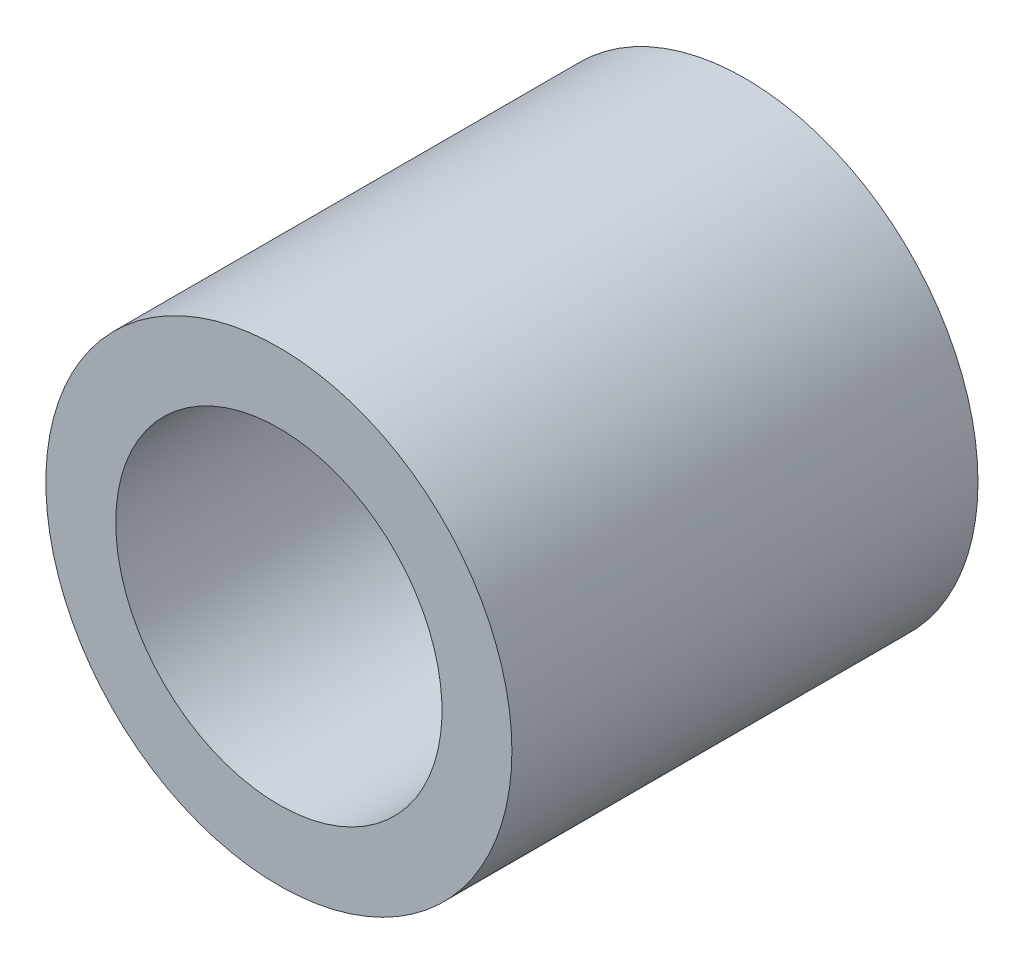
ISO-10303-21;
HEADER;
FILE_DESCRIPTION(('STEP AP214'),'2;1');
FILE_NAME('part.step','',(''),(''),'','','');
FILE_SCHEMA(('AUTOMOTIVE_DESIGN { 1 0 10303 214 1 1 1 1 }'));
ENDSEC;
DATA;
#1=APPLICATION_CONTEXT('core data for automotive mechanical design processes');
#2=APPLICATION_PROTOCOL_DEFINITION('international standard','automotive_design',2000,#1);
#3=PRODUCT_CONTEXT('',#1,'mechanical');
#4=PRODUCT('Part','Part','',(#3));
#5=PRODUCT_RELATED_PRODUCT_CATEGORY('part','',(#4));
#6=PRODUCT_DEFINITION_FORMATION('','',#4);
#7=PRODUCT_DEFINITION_CONTEXT('part definition',#1,'design');
#8=PRODUCT_DEFINITION('design','',#6,#7);
#9=PRODUCT_DEFINITION_SHAPE('','',#8);
#10=(LENGTH_UNIT() NAMED_UNIT(*) SI_UNIT(.MILLI.,.METRE.));
#11=(NAMED_UNIT(*) PLANE_ANGLE_UNIT() SI_UNIT($,.RADIAN.));
#12=(NAMED_UNIT(*) SI_UNIT($,.STERADIAN.) SOLID_ANGLE_UNIT());
#13=UNCERTAINTY_MEASURE_WITH_UNIT(LENGTH_MEASURE(1.E-05),#10,'distance_accuracy_value','');
#14=(GEOMETRIC_REPRESENTATION_CONTEXT(3) GLOBAL_UNCERTAINTY_ASSIGNED_CONTEXT((#13)) GLOBAL_UNIT_ASSIGNED_CONTEXT((#10,
#11,#12)) REPRESENTATION_CONTEXT('',''));
#15=CARTESIAN_POINT('',(0.,0.,0.));
#16=DIRECTION('',(0.,0.,1.));
#17=DIRECTION('',(1.,0.,0.));
#18=AXIS2_PLACEMENT_3D('',#15,#16,#17);
#19=CARTESIAN_POINT('',(0.,0.,40.));
#20=DIRECTION('',(0.,0.,-1.));
#21=DIRECTION('',(-1.,0.,0.));
#22=AXIS2_PLACEMENT_3D('',#19,#20,#21);
#23=CYLINDRICAL_SURFACE('',#22,20.);
#24=CARTESIAN_POINT('',(0.,0.,40.));
#25=DIRECTION('',(0.,0.,1.));
#26=DIRECTION('',(1.,0.,0.));
#27=AXIS2_PLACEMENT_3D('',#24,#25,#26);
#28=CIRCLE('',#27,20.);
#29=CARTESIAN_POINT('',(20.,0.,40.));
#30=VERTEX_POINT('',#29);
#31=EDGE_CURVE('E13',#30,#30,#28,.T.);
#32=ORIENTED_EDGE('',*,*,#31,.F.);
#33=EDGE_LOOP('',(#32));
#34=FACE_BOUND('',#33,.T.);
#35=CARTESIAN_POINT('',(0.,0.,0.));
#36=DIRECTION('',(0.,0.,1.));
#37=DIRECTION('',(1.,0.,0.));
#38=AXIS2_PLACEMENT_3D('',#35,#36,#37);
#39=CIRCLE('',#38,20.);
#40=CARTESIAN_POINT('',(20.,0.,0.));
#41=VERTEX_POINT('',#40);
#42=EDGE_CURVE('E59',#41,#41,#39,.T.);
#43=ORIENTED_EDGE('',*,*,#42,.T.);
#44=EDGE_LOOP('',(#43));
#45=FACE_BOUND('',#44,.T.);
#46=ADVANCED_FACE('F54',(#34,#45),#23,.T.);
#47=CARTESIAN_POINT('',(0.,0.,40.));
#48=DIRECTION('',(0.,0.,1.));
#49=DIRECTION('',(1.,0.,0.));
#50=AXIS2_PLACEMENT_3D('',#47,#48,#49);
#51=PLANE('',#50);
#52=CARTESIAN_POINT('',(0.,0.,40.));
#53=DIRECTION('',(0.,0.,-1.));
#54=DIRECTION('',(-1.,0.,0.));
#55=AXIS2_PLACEMENT_3D('',#52,#53,#54);
#56=CIRCLE('',#55,14.);
#57=CARTESIAN_POINT('',(-14.,0.,40.));
#58=VERTEX_POINT('',#57);
#59=EDGE_CURVE('E64',#58,#58,#56,.T.);
#60=ORIENTED_EDGE('',*,*,#59,.T.);
#61=EDGE_LOOP('',(#60));
#62=FACE_BOUND('',#61,.T.);
#63=ORIENTED_EDGE('',*,*,#31,.T.);
#64=EDGE_LOOP('',(#63));
#65=FACE_BOUND('',#64,.T.);
#66=ADVANCED_FACE('F71',(#62,#65),#51,.T.);
#67=CARTESIAN_POINT('',(0.,0.,0.));
#68=DIRECTION('',(0.,0.,1.));
#69=DIRECTION('',(1.,0.,0.));
#70=AXIS2_PLACEMENT_3D('',#67,#68,#69);
#71=PLANE('',#70);
#72=CARTESIAN_POINT('',(0.,0.,0.));
#73=DIRECTION('',(0.,0.,-1.));
#74=DIRECTION('',(-1.,0.,0.));
#75=AXIS2_PLACEMENT_3D('',#72,#73,#74);
#76=CIRCLE('',#75,14.);
#77=CARTESIAN_POINT('',(-14.,0.,0.));
#78=VERTEX_POINT('',#77);
#79=EDGE_CURVE('E70',#78,#78,#76,.T.);
#80=ORIENTED_EDGE('',*,*,#79,.F.);
#81=EDGE_LOOP('',(#80));
#82=FACE_BOUND('',#81,.T.);
#83=ORIENTED_EDGE('',*,*,#42,.F.);
#84=EDGE_LOOP('',(#83));
#85=FACE_BOUND('',#84,.T.);
#86=ADVANCED_FACE('F76',(#82,#85),#71,.F.);
#87=CARTESIAN_POINT('',(0.,0.,40.));
#88=DIRECTION('',(0.,0.,-1.));
#89=DIRECTION('',(-1.,0.,0.));
#90=AXIS2_PLACEMENT_3D('',#87,#88,#89);
#91=CYLINDRICAL_SURFACE('',#90,14.);
#92=ORIENTED_EDGE('',*,*,#59,.F.);
#93=EDGE_LOOP('',(#92));
#94=FACE_BOUND('',#93,.T.);
#95=ORIENTED_EDGE('',*,*,#79,.T.);
#96=EDGE_LOOP('',(#95));
#97=FACE_BOUND('',#96,.T.);
#98=ADVANCED_FACE('F74',(#94,#97),#91,.F.);
#99=CLOSED_SHELL('',(#46,#66,#86,#98));
#100=MANIFOLD_SOLID_BREP('B2',#99);
#101=ADVANCED_BREP_SHAPE_REPRESENTATION('',(#18,#100),#14);
#102=SHAPE_DEFINITION_REPRESENTATION(#9,#101);
ENDSEC;
END-ISO-10303-21;
